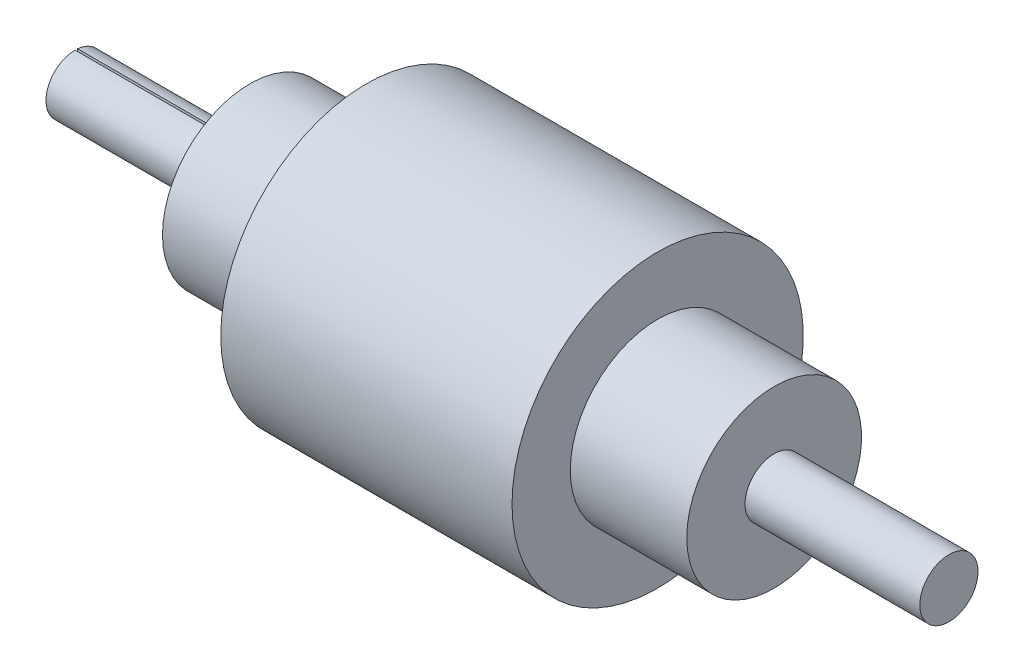
ISO-10303-21;
HEADER;
FILE_DESCRIPTION(('STEP AP214'),'2;1');
FILE_NAME('part.step','',(''),(''),'','','');
FILE_SCHEMA(('AUTOMOTIVE_DESIGN { 1 0 10303 214 1 1 1 1 }'));
ENDSEC;
DATA;
#1=APPLICATION_CONTEXT('core data for automotive mechanical design processes');
#2=APPLICATION_PROTOCOL_DEFINITION('international standard','automotive_design',2000,#1);
#3=PRODUCT_CONTEXT('',#1,'mechanical');
#4=PRODUCT('Part','Part','',(#3));
#5=PRODUCT_RELATED_PRODUCT_CATEGORY('part','',(#4));
#6=PRODUCT_DEFINITION_FORMATION('','',#4);
#7=PRODUCT_DEFINITION_CONTEXT('part definition',#1,'design');
#8=PRODUCT_DEFINITION('design','',#6,#7);
#9=PRODUCT_DEFINITION_SHAPE('','',#8);
#10=(LENGTH_UNIT() NAMED_UNIT(*) SI_UNIT(.MILLI.,.METRE.));
#11=(NAMED_UNIT(*) PLANE_ANGLE_UNIT() SI_UNIT($,.RADIAN.));
#12=(NAMED_UNIT(*) SI_UNIT($,.STERADIAN.) SOLID_ANGLE_UNIT());
#13=UNCERTAINTY_MEASURE_WITH_UNIT(LENGTH_MEASURE(1.E-05),#10,'distance_accuracy_value','');
#14=(GEOMETRIC_REPRESENTATION_CONTEXT(3) GLOBAL_UNCERTAINTY_ASSIGNED_CONTEXT((#13)) GLOBAL_UNIT_ASSIGNED_CONTEXT((#10,
#11,#12)) REPRESENTATION_CONTEXT('',''));
#15=CARTESIAN_POINT('',(0.,0.,0.));
#16=DIRECTION('',(0.,0.,1.));
#17=DIRECTION('',(1.,0.,0.));
#18=AXIS2_PLACEMENT_3D('',#15,#16,#17);
#19=CARTESIAN_POINT('',(-152.206983033896,0.,0.));
#20=DIRECTION('',(-1.,0.,0.));
#21=DIRECTION('',(0.,0.,1.));
#22=AXIS2_PLACEMENT_3D('',#19,#20,#21);
#23=PLANE('',#22);
#24=CARTESIAN_POINT('',(-152.206983033896,0.,0.));
#25=DIRECTION('',(-1.,0.,0.));
#26=DIRECTION('',(0.,0.,1.));
#27=AXIS2_PLACEMENT_3D('',#24,#25,#26);
#28=CIRCLE('',#27,10.);
#29=CARTESIAN_POINT('',(-152.206983033896,9.96194698091747,-0.871557427476442));
#30=VERTEX_POINT('',#29);
#31=CARTESIAN_POINT('',(-152.206983033896,10.,0.));
#32=VERTEX_POINT('',#31);
#33=EDGE_CURVE('E11',#30,#32,#28,.T.);
#34=ORIENTED_EDGE('',*,*,#33,.T.);
#35=DIRECTION('',(0.,1.,0.));
#36=VECTOR('',#35,1.);
#37=CARTESIAN_POINT('',(-152.206983033896,0.,0.));
#38=LINE('',#37,#36);
#39=CARTESIAN_POINT('',(-152.206983033896,0.,0.));
#40=VERTEX_POINT('',#39);
#41=EDGE_CURVE('E89',#40,#32,#38,.T.);
#42=ORIENTED_EDGE('',*,*,#41,.F.);
#43=DIRECTION('',(0.,0.996194698091747,-0.0871557427476442));
#44=VECTOR('',#43,1.);
#45=CARTESIAN_POINT('',(-152.206983033896,0.,0.));
#46=LINE('',#45,#44);
#47=EDGE_CURVE('E79',#40,#30,#46,.T.);
#48=ORIENTED_EDGE('',*,*,#47,.T.);
#49=EDGE_LOOP('',(#34,#42,#48));
#50=FACE_BOUND('',#49,.T.);
#51=ADVANCED_FACE('F39',(#50),#23,.T.);
#52=CARTESIAN_POINT('',(-163.4040596468,0.,0.));
#53=DIRECTION('',(-1.,0.,0.));
#54=DIRECTION('',(0.,0.,1.));
#55=AXIS2_PLACEMENT_3D('',#52,#53,#54);
#56=CYLINDRICAL_SURFACE('',#55,10.);
#57=CARTESIAN_POINT('',(-92.2069830338965,0.,0.));
#58=DIRECTION('',(-1.,0.,0.));
#59=DIRECTION('',(0.,0.,1.));
#60=AXIS2_PLACEMENT_3D('',#57,#58,#59);
#61=CIRCLE('',#60,10.);
#62=CARTESIAN_POINT('',(-92.2069830338965,9.96194698091747,-0.871557427476442));
#63=VERTEX_POINT('',#62);
#64=CARTESIAN_POINT('',(-92.2069830338965,10.,0.));
#65=VERTEX_POINT('',#64);
#66=EDGE_CURVE('E46',#63,#65,#61,.T.);
#67=ORIENTED_EDGE('',*,*,#66,.T.);
#68=DIRECTION('',(1.,0.,0.));
#69=VECTOR('',#68,1.);
#70=CARTESIAN_POINT('',(-152.206983033896,10.,0.));
#71=LINE('',#70,#69);
#72=EDGE_CURVE('E95',#32,#65,#71,.T.);
#73=ORIENTED_EDGE('',*,*,#72,.F.);
#74=ORIENTED_EDGE('',*,*,#33,.F.);
#75=DIRECTION('',(1.,0.,0.));
#76=VECTOR('',#75,1.);
#77=CARTESIAN_POINT('',(-152.206983033896,9.96194698091747,-0.871557427476442));
#78=LINE('',#77,#76);
#79=EDGE_CURVE('E85',#30,#63,#78,.T.);
#80=ORIENTED_EDGE('',*,*,#79,.T.);
#81=EDGE_LOOP('',(#67,#73,#74,#80));
#82=FACE_BOUND('',#81,.T.);
#83=ADVANCED_FACE('F84',(#82),#56,.T.);
#84=CARTESIAN_POINT('',(0.,0.,0.));
#85=DIRECTION('',(0.,-0.0871557427476442,-0.996194698091747));
#86=DIRECTION('',(-1.,0.,0.));
#87=AXIS2_PLACEMENT_3D('',#84,#85,#86);
#88=PLANE('',#87);
#89=DIRECTION('',(1.,0.,0.));
#90=VECTOR('',#89,1.);
#91=CARTESIAN_POINT('',(-152.206983033896,0.,0.));
#92=LINE('',#91,#90);
#93=CARTESIAN_POINT('',(-92.2069830338965,0.,0.));
#94=VERTEX_POINT('',#93);
#95=EDGE_CURVE('E52',#40,#94,#92,.T.);
#96=ORIENTED_EDGE('',*,*,#95,.T.);
#97=DIRECTION('',(0.,-0.996194698091747,0.0871557427476442));
#98=VECTOR('',#97,1.);
#99=CARTESIAN_POINT('',(-92.2069830338965,9.96194698091747,-0.871557427476442));
#100=LINE('',#99,#98);
#101=EDGE_CURVE('E73',#63,#94,#100,.T.);
#102=ORIENTED_EDGE('',*,*,#101,.F.);
#103=ORIENTED_EDGE('',*,*,#79,.F.);
#104=ORIENTED_EDGE('',*,*,#47,.F.);
#105=EDGE_LOOP('',(#96,#102,#103,#104));
#106=FACE_BOUND('',#105,.T.);
#107=ADVANCED_FACE('F78',(#106),#88,.F.);
#108=CARTESIAN_POINT('',(0.,0.,0.));
#109=DIRECTION('',(0.,0.,-1.));
#110=DIRECTION('',(-1.,0.,0.));
#111=AXIS2_PLACEMENT_3D('',#108,#109,#110);
#112=PLANE('',#111);
#113=ORIENTED_EDGE('',*,*,#95,.F.);
#114=ORIENTED_EDGE('',*,*,#41,.T.);
#115=ORIENTED_EDGE('',*,*,#72,.T.);
#116=DIRECTION('',(0.,-1.,0.));
#117=VECTOR('',#116,1.);
#118=CARTESIAN_POINT('',(-92.2069830338965,10.,0.));
#119=LINE('',#118,#117);
#120=EDGE_CURVE('E77',#65,#94,#119,.T.);
#121=ORIENTED_EDGE('',*,*,#120,.T.);
#122=EDGE_LOOP('',(#113,#114,#115,#121));
#123=FACE_BOUND('',#122,.T.);
#124=ADVANCED_FACE('F140',(#123),#112,.T.);
#125=CARTESIAN_POINT('',(-92.2069830338965,0.,0.));
#126=DIRECTION('',(-1.,0.,0.));
#127=DIRECTION('',(0.,0.,1.));
#128=AXIS2_PLACEMENT_3D('',#125,#126,#127);
#129=PLANE('',#128);
#130=CARTESIAN_POINT('',(-92.2069830338965,0.,0.));
#131=DIRECTION('',(-1.,0.,0.));
#132=DIRECTION('',(0.,0.,1.));
#133=AXIS2_PLACEMENT_3D('',#130,#131,#132);
#134=CIRCLE('',#133,30.);
#135=CARTESIAN_POINT('',(-92.2069830338965,0.,30.));
#136=VERTEX_POINT('',#135);
#137=EDGE_CURVE('E117',#136,#136,#134,.T.);
#138=ORIENTED_EDGE('',*,*,#137,.T.);
#139=EDGE_LOOP('',(#138));
#140=FACE_BOUND('',#139,.T.);
#141=ORIENTED_EDGE('',*,*,#66,.F.);
#142=ORIENTED_EDGE('',*,*,#101,.T.);
#143=ORIENTED_EDGE('',*,*,#120,.F.);
#144=EDGE_LOOP('',(#141,#142,#143));
#145=FACE_BOUND('',#144,.T.);
#146=ADVANCED_FACE('F74',(#140,#145),#129,.T.);
#147=CARTESIAN_POINT('',(147.793016966104,0.,0.));
#148=DIRECTION('',(1.,0.,0.));
#149=DIRECTION('',(0.,0.,-1.));
#150=AXIS2_PLACEMENT_3D('',#147,#148,#149);
#151=PLANE('',#150);
#152=CARTESIAN_POINT('',(147.793016966104,0.,0.));
#153=DIRECTION('',(-1.,0.,0.));
#154=DIRECTION('',(0.,0.,1.));
#155=AXIS2_PLACEMENT_3D('',#152,#153,#154);
#156=CIRCLE('',#155,10.);
#157=CARTESIAN_POINT('',(147.793016966104,0.,10.));
#158=VERTEX_POINT('',#157);
#159=EDGE_CURVE('E92',#158,#158,#156,.T.);
#160=ORIENTED_EDGE('',*,*,#159,.F.);
#161=EDGE_LOOP('',(#160));
#162=FACE_BOUND('',#161,.T.);
#163=ADVANCED_FACE('F145',(#162),#151,.T.);
#164=CARTESIAN_POINT('',(-163.4040596468,0.,0.));
#165=DIRECTION('',(-1.,0.,0.));
#166=DIRECTION('',(0.,0.,1.));
#167=AXIS2_PLACEMENT_3D('',#164,#165,#166);
#168=CYLINDRICAL_SURFACE('',#167,10.);
#169=ORIENTED_EDGE('',*,*,#159,.T.);
#170=EDGE_LOOP('',(#169));
#171=FACE_BOUND('',#170,.T.);
#172=CARTESIAN_POINT('',(87.7930169661035,0.,0.));
#173=DIRECTION('',(-1.,0.,0.));
#174=DIRECTION('',(0.,0.,1.));
#175=AXIS2_PLACEMENT_3D('',#172,#173,#174);
#176=CIRCLE('',#175,10.);
#177=CARTESIAN_POINT('',(87.7930169661035,0.,10.));
#178=VERTEX_POINT('',#177);
#179=EDGE_CURVE('E98',#178,#178,#176,.T.);
#180=ORIENTED_EDGE('',*,*,#179,.F.);
#181=EDGE_LOOP('',(#180));
#182=FACE_BOUND('',#181,.T.);
#183=ADVANCED_FACE('F147',(#171,#182),#168,.T.);
#184=CARTESIAN_POINT('',(87.7930169661036,0.,0.));
#185=DIRECTION('',(1.,0.,0.));
#186=DIRECTION('',(0.,0.,-1.));
#187=AXIS2_PLACEMENT_3D('',#184,#185,#186);
#188=PLANE('',#187);
#189=ORIENTED_EDGE('',*,*,#179,.T.);
#190=EDGE_LOOP('',(#189));
#191=FACE_BOUND('',#190,.T.);
#192=CARTESIAN_POINT('',(87.7930169661035,0.,0.));
#193=DIRECTION('',(-1.,0.,0.));
#194=DIRECTION('',(0.,0.,1.));
#195=AXIS2_PLACEMENT_3D('',#192,#193,#194);
#196=CIRCLE('',#195,30.);
#197=CARTESIAN_POINT('',(87.7930169661035,0.,30.));
#198=VERTEX_POINT('',#197);
#199=EDGE_CURVE('E101',#198,#198,#196,.T.);
#200=ORIENTED_EDGE('',*,*,#199,.F.);
#201=EDGE_LOOP('',(#200));
#202=FACE_BOUND('',#201,.T.);
#203=ADVANCED_FACE('F152',(#191,#202),#188,.T.);
#204=CARTESIAN_POINT('',(-163.4040596468,0.,0.));
#205=DIRECTION('',(-1.,0.,0.));
#206=DIRECTION('',(0.,0.,1.));
#207=AXIS2_PLACEMENT_3D('',#204,#205,#206);
#208=CYLINDRICAL_SURFACE('',#207,30.);
#209=ORIENTED_EDGE('',*,*,#199,.T.);
#210=EDGE_LOOP('',(#209));
#211=FACE_BOUND('',#210,.T.);
#212=CARTESIAN_POINT('',(47.7930169661036,0.,0.));
#213=DIRECTION('',(-1.,0.,0.));
#214=DIRECTION('',(0.,0.,1.));
#215=AXIS2_PLACEMENT_3D('',#212,#213,#214);
#216=CIRCLE('',#215,30.);
#217=CARTESIAN_POINT('',(47.7930169661036,0.,30.));
#218=VERTEX_POINT('',#217);
#219=EDGE_CURVE('E102',#218,#218,#216,.T.);
#220=ORIENTED_EDGE('',*,*,#219,.F.);
#221=EDGE_LOOP('',(#220));
#222=FACE_BOUND('',#221,.T.);
#223=ADVANCED_FACE('F158',(#211,#222),#208,.T.);
#224=CARTESIAN_POINT('',(47.7930169661035,0.,0.));
#225=DIRECTION('',(1.,0.,0.));
#226=DIRECTION('',(0.,0.,-1.));
#227=AXIS2_PLACEMENT_3D('',#224,#225,#226);
#228=PLANE('',#227);
#229=ORIENTED_EDGE('',*,*,#219,.T.);
#230=EDGE_LOOP('',(#229));
#231=FACE_BOUND('',#230,.T.);
#232=CARTESIAN_POINT('',(47.7930169661036,0.,0.));
#233=DIRECTION('',(-1.,0.,0.));
#234=DIRECTION('',(0.,0.,1.));
#235=AXIS2_PLACEMENT_3D('',#232,#233,#234);
#236=CIRCLE('',#235,50.);
#237=CARTESIAN_POINT('',(47.7930169661036,0.,50.));
#238=VERTEX_POINT('',#237);
#239=EDGE_CURVE('E110',#238,#238,#236,.T.);
#240=ORIENTED_EDGE('',*,*,#239,.F.);
#241=EDGE_LOOP('',(#240));
#242=FACE_BOUND('',#241,.T.);
#243=ADVANCED_FACE('F165',(#231,#242),#228,.T.);
#244=CARTESIAN_POINT('',(-163.4040596468,0.,0.));
#245=DIRECTION('',(-1.,0.,0.));
#246=DIRECTION('',(0.,0.,1.));
#247=AXIS2_PLACEMENT_3D('',#244,#245,#246);
#248=CYLINDRICAL_SURFACE('',#247,50.);
#249=ORIENTED_EDGE('',*,*,#239,.T.);
#250=EDGE_LOOP('',(#249));
#251=FACE_BOUND('',#250,.T.);
#252=CARTESIAN_POINT('',(-52.2069830338965,0.,0.));
#253=DIRECTION('',(-1.,0.,0.));
#254=DIRECTION('',(0.,0.,1.));
#255=AXIS2_PLACEMENT_3D('',#252,#253,#254);
#256=CIRCLE('',#255,50.);
#257=CARTESIAN_POINT('',(-52.2069830338965,0.,50.));
#258=VERTEX_POINT('',#257);
#259=EDGE_CURVE('E109',#258,#258,#256,.T.);
#260=ORIENTED_EDGE('',*,*,#259,.F.);
#261=EDGE_LOOP('',(#260));
#262=FACE_BOUND('',#261,.T.);
#263=ADVANCED_FACE('F129',(#251,#262),#248,.T.);
#264=CARTESIAN_POINT('',(-52.2069830338965,0.,0.));
#265=DIRECTION('',(-1.,0.,0.));
#266=DIRECTION('',(0.,0.,1.));
#267=AXIS2_PLACEMENT_3D('',#264,#265,#266);
#268=PLANE('',#267);
#269=ORIENTED_EDGE('',*,*,#259,.T.);
#270=EDGE_LOOP('',(#269));
#271=FACE_BOUND('',#270,.T.);
#272=CARTESIAN_POINT('',(-52.2069830338965,0.,0.));
#273=DIRECTION('',(-1.,0.,0.));
#274=DIRECTION('',(0.,0.,1.));
#275=AXIS2_PLACEMENT_3D('',#272,#273,#274);
#276=CIRCLE('',#275,30.);
#277=CARTESIAN_POINT('',(-52.2069830338965,0.,30.));
#278=VERTEX_POINT('',#277);
#279=EDGE_CURVE('E114',#278,#278,#276,.T.);
#280=ORIENTED_EDGE('',*,*,#279,.F.);
#281=EDGE_LOOP('',(#280));
#282=FACE_BOUND('',#281,.T.);
#283=ADVANCED_FACE('F121',(#271,#282),#268,.T.);
#284=CARTESIAN_POINT('',(-163.4040596468,0.,0.));
#285=DIRECTION('',(-1.,0.,0.));
#286=DIRECTION('',(0.,0.,1.));
#287=AXIS2_PLACEMENT_3D('',#284,#285,#286);
#288=CYLINDRICAL_SURFACE('',#287,30.);
#289=ORIENTED_EDGE('',*,*,#279,.T.);
#290=EDGE_LOOP('',(#289));
#291=FACE_BOUND('',#290,.T.);
#292=ORIENTED_EDGE('',*,*,#137,.F.);
#293=EDGE_LOOP('',(#292));
#294=FACE_BOUND('',#293,.T.);
#295=ADVANCED_FACE('F123',(#291,#294),#288,.T.);
#296=CLOSED_SHELL('',(#51,#83,#107,#124,#146,#163,#183,#203,#223,#243,#263,#283,#295));
#297=MANIFOLD_SOLID_BREP('B2',#296);
#298=ADVANCED_BREP_SHAPE_REPRESENTATION('',(#18,#297),#14);
#299=SHAPE_DEFINITION_REPRESENTATION(#9,#298);
ENDSEC;
END-ISO-10303-21;
